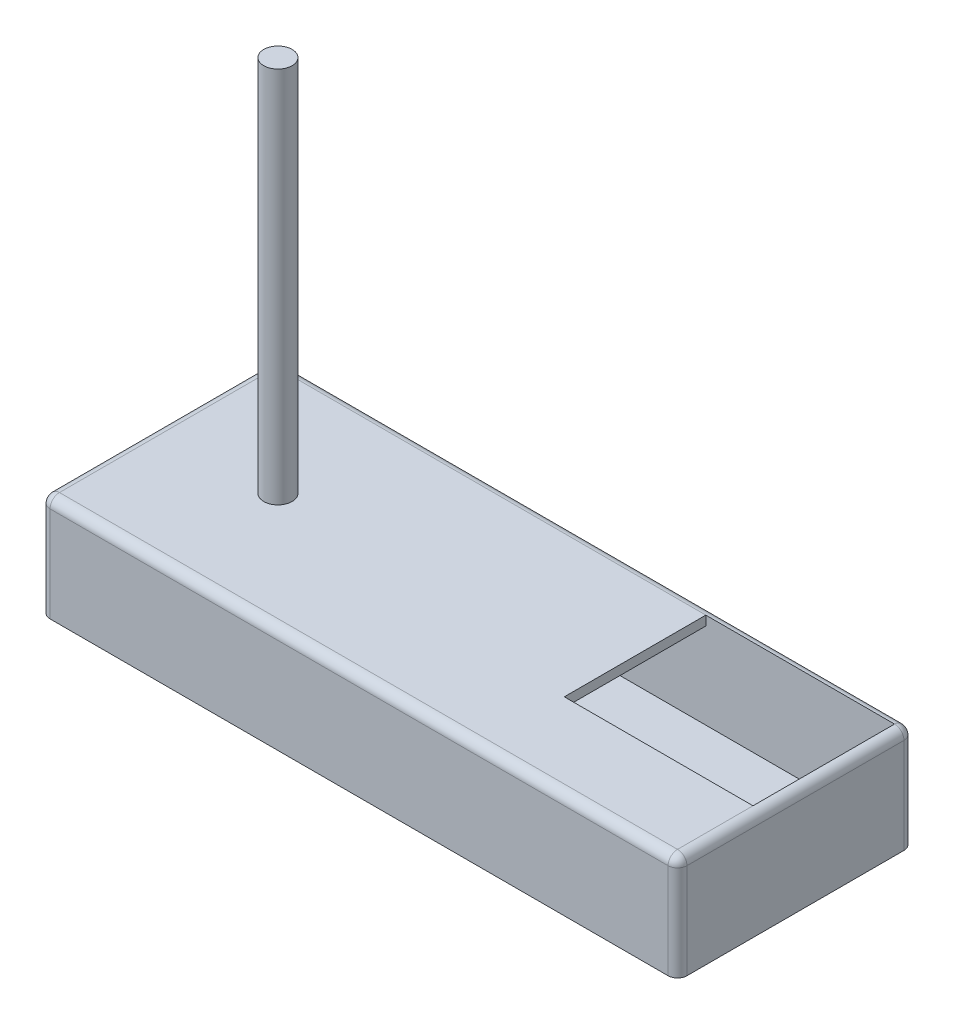
ISO-10303-21;
HEADER;
FILE_DESCRIPTION(('STEP AP214'),'2;1');
FILE_NAME('part.step','',(''),(''),'','','');
FILE_SCHEMA(('AUTOMOTIVE_DESIGN { 1 0 10303 214 1 1 1 1 }'));
ENDSEC;
DATA;
#1=APPLICATION_CONTEXT('core data for automotive mechanical design processes');
#2=APPLICATION_PROTOCOL_DEFINITION('international standard','automotive_design',2000,#1);
#3=PRODUCT_CONTEXT('',#1,'mechanical');
#4=PRODUCT('Part','Part','',(#3));
#5=PRODUCT_RELATED_PRODUCT_CATEGORY('part','',(#4));
#6=PRODUCT_DEFINITION_FORMATION('','',#4);
#7=PRODUCT_DEFINITION_CONTEXT('part definition',#1,'design');
#8=PRODUCT_DEFINITION('design','',#6,#7);
#9=PRODUCT_DEFINITION_SHAPE('','',#8);
#10=(LENGTH_UNIT() NAMED_UNIT(*) SI_UNIT(.MILLI.,.METRE.));
#11=(NAMED_UNIT(*) PLANE_ANGLE_UNIT() SI_UNIT($,.RADIAN.));
#12=(NAMED_UNIT(*) SI_UNIT($,.STERADIAN.) SOLID_ANGLE_UNIT());
#13=UNCERTAINTY_MEASURE_WITH_UNIT(LENGTH_MEASURE(1.E-05),#10,'distance_accuracy_value','');
#14=(GEOMETRIC_REPRESENTATION_CONTEXT(3) GLOBAL_UNCERTAINTY_ASSIGNED_CONTEXT((#13)) GLOBAL_UNIT_ASSIGNED_CONTEXT((#10,
#11,#12)) REPRESENTATION_CONTEXT('',''));
#15=CARTESIAN_POINT('',(0.,0.,0.));
#16=DIRECTION('',(0.,0.,1.));
#17=DIRECTION('',(1.,0.,0.));
#18=AXIS2_PLACEMENT_3D('',#15,#16,#17);
#19=CARTESIAN_POINT('',(-83.185,28.194,-31.75));
#20=DIRECTION('',(1.,0.,0.));
#21=DIRECTION('',(0.,0.,-1.));
#22=AXIS2_PLACEMENT_3D('',#19,#20,#21);
#23=PLANE('',#22);
#24=DIRECTION('',(0.,-1.,0.));
#25=VECTOR('',#24,1.);
#26=CARTESIAN_POINT('',(-83.185,28.194,-29.21));
#27=LINE('',#26,#25);
#28=CARTESIAN_POINT('',(-83.185,2.77966033261084,-29.21));
#29=VERTEX_POINT('',#28);
#30=CARTESIAN_POINT('',(-83.185,2.54,-29.21));
#31=VERTEX_POINT('',#30);
#32=EDGE_CURVE('E334',#29,#31,#27,.T.);
#33=ORIENTED_EDGE('',*,*,#32,.F.);
#34=DIRECTION('',(0.,0.,1.));
#35=VECTOR('',#34,1.);
#36=CARTESIAN_POINT('',(-83.185,2.77966033261084,29.21));
#37=LINE('',#36,#35);
#38=CARTESIAN_POINT('',(-83.185,2.77966033261084,29.21));
#39=VERTEX_POINT('',#38);
#40=EDGE_CURVE('E178',#29,#39,#37,.T.);
#41=ORIENTED_EDGE('',*,*,#40,.T.);
#42=DIRECTION('',(0.,-1.,0.));
#43=VECTOR('',#42,1.);
#44=CARTESIAN_POINT('',(-83.185,28.194,29.21));
#45=LINE('',#44,#43);
#46=CARTESIAN_POINT('',(-83.185,2.54,29.21));
#47=VERTEX_POINT('',#46);
#48=EDGE_CURVE('E175',#39,#47,#45,.T.);
#49=ORIENTED_EDGE('',*,*,#48,.T.);
#50=DIRECTION('',(0.,0.,1.));
#51=VECTOR('',#50,1.);
#52=CARTESIAN_POINT('',(-83.185,2.54,0.));
#53=LINE('',#52,#51);
#54=EDGE_CURVE('E328',#31,#47,#53,.T.);
#55=ORIENTED_EDGE('',*,*,#54,.F.);
#56=EDGE_LOOP('',(#33,#41,#49,#55));
#57=FACE_BOUND('',#56,.T.);
#58=ADVANCED_FACE('F47',(#57),#23,.T.);
#59=CARTESIAN_POINT('',(0.,28.194,0.));
#60=DIRECTION('',(0.,-1.,0.));
#61=DIRECTION('',(0.,0.,-1.));
#62=AXIS2_PLACEMENT_3D('',#59,#60,#61);
#63=PLANE('',#62);
#64=CARTESIAN_POINT('',(-53.5798390640864,28.194,0.));
#65=DIRECTION('',(0.,-1.,0.));
#66=DIRECTION('',(0.,0.,-1.));
#67=AXIS2_PLACEMENT_3D('',#64,#65,#66);
#68=CIRCLE('',#67,3.81);
#69=CARTESIAN_POINT('',(-53.5798390640864,28.194,-3.81));
#70=VERTEX_POINT('',#69);
#71=EDGE_CURVE('E11',#70,#70,#68,.F.);
#72=ORIENTED_EDGE('',*,*,#71,.F.);
#73=EDGE_LOOP('',(#72));
#74=FACE_BOUND('',#73,.T.);
#75=DIRECTION('',(-1.,0.,0.));
#76=VECTOR('',#75,1.);
#77=CARTESIAN_POINT('',(83.185,28.194,8.89));
#78=LINE('',#77,#76);
#79=CARTESIAN_POINT('',(83.185,28.194,8.89));
#80=VERTEX_POINT('',#79);
#81=CARTESIAN_POINT('',(32.385,28.194,8.89));
#82=VERTEX_POINT('',#81);
#83=EDGE_CURVE('E435',#80,#82,#78,.T.);
#84=ORIENTED_EDGE('',*,*,#83,.T.);
#85=DIRECTION('',(0.,0.,1.));
#86=VECTOR('',#85,1.);
#87=CARTESIAN_POINT('',(32.385,28.194,-29.21));
#88=LINE('',#87,#86);
#89=CARTESIAN_POINT('',(32.385,28.194,-29.21));
#90=VERTEX_POINT('',#89);
#91=EDGE_CURVE('E295',#90,#82,#88,.T.);
#92=ORIENTED_EDGE('',*,*,#91,.F.);
#93=DIRECTION('',(-1.,0.,0.));
#94=VECTOR('',#93,1.);
#95=CARTESIAN_POINT('',(0.,28.194,-29.21));
#96=LINE('',#95,#94);
#97=CARTESIAN_POINT('',(-83.185,28.194,-29.21));
#98=VERTEX_POINT('',#97);
#99=EDGE_CURVE('E343',#90,#98,#96,.T.);
#100=ORIENTED_EDGE('',*,*,#99,.T.);
#101=DIRECTION('',(0.,0.,1.));
#102=VECTOR('',#101,1.);
#103=CARTESIAN_POINT('',(-83.185,28.194,0.));
#104=LINE('',#103,#102);
#105=CARTESIAN_POINT('',(-83.185,28.194,29.21));
#106=VERTEX_POINT('',#105);
#107=EDGE_CURVE('E241',#98,#106,#104,.T.);
#108=ORIENTED_EDGE('',*,*,#107,.T.);
#109=DIRECTION('',(1.,0.,0.));
#110=VECTOR('',#109,1.);
#111=CARTESIAN_POINT('',(0.,28.194,29.21));
#112=LINE('',#111,#110);
#113=CARTESIAN_POINT('',(83.185,28.194,29.21));
#114=VERTEX_POINT('',#113);
#115=EDGE_CURVE('E379',#106,#114,#112,.T.);
#116=ORIENTED_EDGE('',*,*,#115,.T.);
#117=DIRECTION('',(0.,0.,-1.));
#118=VECTOR('',#117,1.);
#119=CARTESIAN_POINT('',(83.185,28.194,0.));
#120=LINE('',#119,#118);
#121=EDGE_CURVE('E56',#114,#80,#120,.T.);
#122=ORIENTED_EDGE('',*,*,#121,.T.);
#123=EDGE_LOOP('',(#84,#92,#100,#108,#116,#122));
#124=FACE_BOUND('',#123,.T.);
#125=ADVANCED_FACE('F463',(#74,#124),#63,.F.);
#126=CARTESIAN_POINT('',(-85.725,28.194,-31.75));
#127=DIRECTION('',(1.,0.,0.));
#128=DIRECTION('',(0.,0.,-1.));
#129=AXIS2_PLACEMENT_3D('',#126,#127,#128);
#130=PLANE('',#129);
#131=DIRECTION('',(0.,-1.,0.));
#132=VECTOR('',#131,1.);
#133=CARTESIAN_POINT('',(-85.725,28.194,29.21));
#134=LINE('',#133,#132);
#135=CARTESIAN_POINT('',(-85.725,0.,29.21));
#136=VERTEX_POINT('',#135);
#137=CARTESIAN_POINT('',(-85.725,2.77966033261084,29.21));
#138=VERTEX_POINT('',#137);
#139=EDGE_CURVE('E195',#136,#138,#134,.F.);
#140=ORIENTED_EDGE('',*,*,#139,.T.);
#141=DIRECTION('',(0.,0.,1.));
#142=VECTOR('',#141,1.);
#143=CARTESIAN_POINT('',(-85.725,2.77966033261084,29.21));
#144=LINE('',#143,#142);
#145=CARTESIAN_POINT('',(-85.725,2.77966033261084,-29.21));
#146=VERTEX_POINT('',#145);
#147=EDGE_CURVE('E181',#146,#138,#144,.T.);
#148=ORIENTED_EDGE('',*,*,#147,.F.);
#149=DIRECTION('',(0.,-1.,0.));
#150=VECTOR('',#149,1.);
#151=CARTESIAN_POINT('',(-85.725,28.194,-29.21));
#152=LINE('',#151,#150);
#153=CARTESIAN_POINT('',(-85.725,0.,-29.21));
#154=VERTEX_POINT('',#153);
#155=EDGE_CURVE('E207',#146,#154,#152,.T.);
#156=ORIENTED_EDGE('',*,*,#155,.T.);
#157=DIRECTION('',(0.,0.,1.));
#158=VECTOR('',#157,1.);
#159=CARTESIAN_POINT('',(-85.725,0.,-31.75));
#160=LINE('',#159,#158);
#161=EDGE_CURVE('E205',#154,#136,#160,.T.);
#162=ORIENTED_EDGE('',*,*,#161,.T.);
#163=EDGE_LOOP('',(#140,#148,#156,#162));
#164=FACE_BOUND('',#163,.T.);
#165=ADVANCED_FACE('F203',(#164),#130,.F.);
#166=CARTESIAN_POINT('',(85.725,28.194,31.75));
#167=DIRECTION('',(0.,0.,-1.));
#168=DIRECTION('',(-1.,0.,0.));
#169=AXIS2_PLACEMENT_3D('',#166,#167,#168);
#170=PLANE('',#169);
#171=DIRECTION('',(1.,0.,0.));
#172=VECTOR('',#171,1.);
#173=CARTESIAN_POINT('',(85.725,0.,31.75));
#174=LINE('',#173,#172);
#175=CARTESIAN_POINT('',(-83.185,0.,31.75));
#176=VERTEX_POINT('',#175);
#177=CARTESIAN_POINT('',(83.185,0.,31.75));
#178=VERTEX_POINT('',#177);
#179=EDGE_CURVE('E336',#176,#178,#174,.T.);
#180=ORIENTED_EDGE('',*,*,#179,.T.);
#181=DIRECTION('',(0.,-1.,0.));
#182=VECTOR('',#181,1.);
#183=CARTESIAN_POINT('',(83.185,28.194,31.75));
#184=LINE('',#183,#182);
#185=CARTESIAN_POINT('',(83.185,25.654,31.75));
#186=VERTEX_POINT('',#185);
#187=EDGE_CURVE('E275',#178,#186,#184,.F.);
#188=ORIENTED_EDGE('',*,*,#187,.T.);
#189=DIRECTION('',(1.,0.,0.));
#190=VECTOR('',#189,1.);
#191=CARTESIAN_POINT('',(85.725,25.654,31.75));
#192=LINE('',#191,#190);
#193=CARTESIAN_POINT('',(-83.1849999999999,25.654,31.75));
#194=VERTEX_POINT('',#193);
#195=EDGE_CURVE('E215',#186,#194,#192,.F.);
#196=ORIENTED_EDGE('',*,*,#195,.T.);
#197=DIRECTION('',(0.,-1.,0.));
#198=VECTOR('',#197,1.);
#199=CARTESIAN_POINT('',(-83.185,28.194,31.75));
#200=LINE('',#199,#198);
#201=EDGE_CURVE('E234',#194,#176,#200,.T.);
#202=ORIENTED_EDGE('',*,*,#201,.T.);
#203=EDGE_LOOP('',(#180,#188,#196,#202));
#204=FACE_BOUND('',#203,.T.);
#205=ADVANCED_FACE('F386',(#204),#170,.F.);
#206=CARTESIAN_POINT('',(85.725,28.194,-31.75));
#207=DIRECTION('',(-1.,0.,0.));
#208=DIRECTION('',(0.,0.,1.));
#209=AXIS2_PLACEMENT_3D('',#206,#207,#208);
#210=PLANE('',#209);
#211=DIRECTION('',(0.,0.,-1.));
#212=VECTOR('',#211,1.);
#213=CARTESIAN_POINT('',(85.725,25.654,-31.75));
#214=LINE('',#213,#212);
#215=CARTESIAN_POINT('',(85.725,25.654,-29.21));
#216=VERTEX_POINT('',#215);
#217=CARTESIAN_POINT('',(85.725,25.654,29.21));
#218=VERTEX_POINT('',#217);
#219=EDGE_CURVE('E244',#216,#218,#214,.F.);
#220=ORIENTED_EDGE('',*,*,#219,.T.);
#221=DIRECTION('',(0.,-1.,0.));
#222=VECTOR('',#221,1.);
#223=CARTESIAN_POINT('',(85.725,28.194,29.21));
#224=LINE('',#223,#222);
#225=CARTESIAN_POINT('',(85.725,0.,29.21));
#226=VERTEX_POINT('',#225);
#227=EDGE_CURVE('E265',#218,#226,#224,.T.);
#228=ORIENTED_EDGE('',*,*,#227,.T.);
#229=DIRECTION('',(0.,0.,-1.));
#230=VECTOR('',#229,1.);
#231=CARTESIAN_POINT('',(85.725,0.,-31.75));
#232=LINE('',#231,#230);
#233=CARTESIAN_POINT('',(85.725,0.,-29.21));
#234=VERTEX_POINT('',#233);
#235=EDGE_CURVE('E329',#226,#234,#232,.T.);
#236=ORIENTED_EDGE('',*,*,#235,.T.);
#237=DIRECTION('',(0.,-1.,0.));
#238=VECTOR('',#237,1.);
#239=CARTESIAN_POINT('',(85.725,28.194,-29.21));
#240=LINE('',#239,#238);
#241=EDGE_CURVE('E262',#234,#216,#240,.F.);
#242=ORIENTED_EDGE('',*,*,#241,.T.);
#243=EDGE_LOOP('',(#220,#228,#236,#242));
#244=FACE_BOUND('',#243,.T.);
#245=ADVANCED_FACE('F713',(#244),#210,.F.);
#246=CARTESIAN_POINT('',(85.725,28.194,-31.75));
#247=DIRECTION('',(0.,0.,1.));
#248=DIRECTION('',(1.,0.,0.));
#249=AXIS2_PLACEMENT_3D('',#246,#247,#248);
#250=PLANE('',#249);
#251=DIRECTION('',(-1.,0.,0.));
#252=VECTOR('',#251,1.);
#253=CARTESIAN_POINT('',(85.725,25.654,-31.75));
#254=LINE('',#253,#252);
#255=CARTESIAN_POINT('',(-83.185,25.654,-31.75));
#256=VERTEX_POINT('',#255);
#257=CARTESIAN_POINT('',(83.185,25.654,-31.75));
#258=VERTEX_POINT('',#257);
#259=EDGE_CURVE('E320',#256,#258,#254,.F.);
#260=ORIENTED_EDGE('',*,*,#259,.T.);
#261=DIRECTION('',(0.,-1.,0.));
#262=VECTOR('',#261,1.);
#263=CARTESIAN_POINT('',(83.185,28.194,-31.75));
#264=LINE('',#263,#262);
#265=CARTESIAN_POINT('',(83.185,0.,-31.75));
#266=VERTEX_POINT('',#265);
#267=EDGE_CURVE('E281',#258,#266,#264,.T.);
#268=ORIENTED_EDGE('',*,*,#267,.T.);
#269=DIRECTION('',(-1.,0.,0.));
#270=VECTOR('',#269,1.);
#271=CARTESIAN_POINT('',(85.725,0.,-31.75));
#272=LINE('',#271,#270);
#273=CARTESIAN_POINT('',(-83.185,0.,-31.75));
#274=VERTEX_POINT('',#273);
#275=EDGE_CURVE('E318',#266,#274,#272,.T.);
#276=ORIENTED_EDGE('',*,*,#275,.T.);
#277=DIRECTION('',(0.,-1.,0.));
#278=VECTOR('',#277,1.);
#279=CARTESIAN_POINT('',(-83.185,28.194,-31.75));
#280=LINE('',#279,#278);
#281=EDGE_CURVE('E227',#274,#256,#280,.F.);
#282=ORIENTED_EDGE('',*,*,#281,.T.);
#283=EDGE_LOOP('',(#260,#268,#276,#282));
#284=FACE_BOUND('',#283,.T.);
#285=ADVANCED_FACE('F317',(#284),#250,.F.);
#286=CARTESIAN_POINT('',(0.,0.,0.));
#287=DIRECTION('',(0.,-1.,0.));
#288=DIRECTION('',(0.,0.,-1.));
#289=AXIS2_PLACEMENT_3D('',#286,#287,#288);
#290=PLANE('',#289);
#291=ORIENTED_EDGE('',*,*,#235,.F.);
#292=CARTESIAN_POINT('',(83.185,0.,29.21));
#293=DIRECTION('',(0.,-1.,0.));
#294=DIRECTION('',(0.,0.,-1.));
#295=AXIS2_PLACEMENT_3D('',#292,#293,#294);
#296=CIRCLE('',#295,2.54);
#297=EDGE_CURVE('E272',#226,#178,#296,.T.);
#298=ORIENTED_EDGE('',*,*,#297,.T.);
#299=ORIENTED_EDGE('',*,*,#179,.F.);
#300=CARTESIAN_POINT('',(-83.185,0.,29.21));
#301=DIRECTION('',(0.,-1.,0.));
#302=DIRECTION('',(0.,0.,-1.));
#303=AXIS2_PLACEMENT_3D('',#300,#301,#302);
#304=CIRCLE('',#303,2.54);
#305=EDGE_CURVE('E220',#176,#136,#304,.T.);
#306=ORIENTED_EDGE('',*,*,#305,.T.);
#307=ORIENTED_EDGE('',*,*,#161,.F.);
#308=CARTESIAN_POINT('',(-83.185,0.,-29.21));
#309=DIRECTION('',(0.,-1.,0.));
#310=DIRECTION('',(0.,0.,-1.));
#311=AXIS2_PLACEMENT_3D('',#308,#309,#310);
#312=CIRCLE('',#311,2.54);
#313=EDGE_CURVE('E223',#154,#274,#312,.T.);
#314=ORIENTED_EDGE('',*,*,#313,.T.);
#315=ORIENTED_EDGE('',*,*,#275,.F.);
#316=CARTESIAN_POINT('',(83.185,0.,-29.21));
#317=DIRECTION('',(0.,-1.,0.));
#318=DIRECTION('',(0.,0.,-1.));
#319=AXIS2_PLACEMENT_3D('',#316,#317,#318);
#320=CIRCLE('',#319,2.54);
#321=EDGE_CURVE('E269',#266,#234,#320,.T.);
#322=ORIENTED_EDGE('',*,*,#321,.T.);
#323=EDGE_LOOP('',(#291,#298,#299,#306,#307,#314,#315,#322));
#324=FACE_BOUND('',#323,.T.);
#325=ADVANCED_FACE('F323',(#324),#290,.T.);
#326=CARTESIAN_POINT('',(0.,25.654,-29.21));
#327=DIRECTION('',(-1.,0.,0.));
#328=DIRECTION('',(0.,0.,1.));
#329=AXIS2_PLACEMENT_3D('',#326,#327,#328);
#330=CYLINDRICAL_SURFACE('',#329,2.54);
#331=CARTESIAN_POINT('',(83.185,28.194,-29.21));
#332=VERTEX_POINT('',#331);
#333=EDGE_CURVE('E373',#332,#90,#96,.T.);
#334=ORIENTED_EDGE('',*,*,#333,.F.);
#335=CARTESIAN_POINT('',(83.185,25.654,-29.21));
#336=DIRECTION('',(-1.,0.,0.));
#337=DIRECTION('',(0.,0.,1.));
#338=AXIS2_PLACEMENT_3D('',#335,#336,#337);
#339=CIRCLE('',#338,2.54);
#340=EDGE_CURVE('E284',#332,#258,#339,.T.);
#341=ORIENTED_EDGE('',*,*,#340,.T.);
#342=ORIENTED_EDGE('',*,*,#259,.F.);
#343=CARTESIAN_POINT('',(-83.185,25.654,-29.21));
#344=DIRECTION('',(-1.,0.,0.));
#345=DIRECTION('',(0.,0.,1.));
#346=AXIS2_PLACEMENT_3D('',#343,#344,#345);
#347=CIRCLE('',#346,2.54);
#348=EDGE_CURVE('E230',#256,#98,#347,.F.);
#349=ORIENTED_EDGE('',*,*,#348,.T.);
#350=ORIENTED_EDGE('',*,*,#99,.F.);
#351=EDGE_LOOP('',(#334,#341,#342,#349,#350));
#352=FACE_BOUND('',#351,.T.);
#353=ADVANCED_FACE('F469',(#352),#330,.T.);
#354=CARTESIAN_POINT('',(0.,25.654,29.21));
#355=DIRECTION('',(1.,0.,0.));
#356=DIRECTION('',(0.,0.,-1.));
#357=AXIS2_PLACEMENT_3D('',#354,#355,#356);
#358=CYLINDRICAL_SURFACE('',#357,2.54);
#359=ORIENTED_EDGE('',*,*,#195,.F.);
#360=CARTESIAN_POINT('',(83.185,25.654,29.21));
#361=DIRECTION('',(1.,0.,0.));
#362=DIRECTION('',(0.,0.,-1.));
#363=AXIS2_PLACEMENT_3D('',#360,#361,#362);
#364=CIRCLE('',#363,2.54);
#365=EDGE_CURVE('E278',#186,#114,#364,.F.);
#366=ORIENTED_EDGE('',*,*,#365,.T.);
#367=ORIENTED_EDGE('',*,*,#115,.F.);
#368=CARTESIAN_POINT('',(-83.185,25.654,29.21));
#369=DIRECTION('',(1.,0.,0.));
#370=DIRECTION('',(0.,0.,-1.));
#371=AXIS2_PLACEMENT_3D('',#368,#369,#370);
#372=CIRCLE('',#371,2.54);
#373=EDGE_CURVE('E237',#106,#194,#372,.T.);
#374=ORIENTED_EDGE('',*,*,#373,.T.);
#375=EDGE_LOOP('',(#359,#366,#367,#374));
#376=FACE_BOUND('',#375,.T.);
#377=ADVANCED_FACE('F393',(#376),#358,.T.);
#378=CARTESIAN_POINT('',(-83.185,28.194,29.21));
#379=DIRECTION('',(0.,-1.,0.));
#380=DIRECTION('',(0.,0.,-1.));
#381=AXIS2_PLACEMENT_3D('',#378,#379,#380);
#382=CYLINDRICAL_SURFACE('',#381,2.54);
#383=ORIENTED_EDGE('',*,*,#305,.F.);
#384=ORIENTED_EDGE('',*,*,#201,.F.);
#385=CARTESIAN_POINT('',(-83.185,25.654,29.21));
#386=DIRECTION('',(0.,1.,0.));
#387=DIRECTION('',(0.,0.,1.));
#388=AXIS2_PLACEMENT_3D('',#385,#386,#387);
#389=CIRCLE('',#388,2.54);
#390=CARTESIAN_POINT('',(-85.725,25.654,29.21));
#391=VERTEX_POINT('',#390);
#392=EDGE_CURVE('E198',#391,#194,#389,.T.);
#393=ORIENTED_EDGE('',*,*,#392,.F.);
#394=DIRECTION('',(0.,1.,0.));
#395=VECTOR('',#394,1.);
#396=CARTESIAN_POINT('',(-85.725,25.654,29.21));
#397=LINE('',#396,#395);
#398=EDGE_CURVE('E173',#138,#391,#397,.T.);
#399=ORIENTED_EDGE('',*,*,#398,.F.);
#400=ORIENTED_EDGE('',*,*,#139,.F.);
#401=EDGE_LOOP('',(#383,#384,#393,#399,#400));
#402=FACE_BOUND('',#401,.T.);
#403=ADVANCED_FACE('F194',(#402),#382,.T.);
#404=CARTESIAN_POINT('',(-83.185,25.654,29.21));
#405=DIRECTION('',(1.,0.,0.));
#406=DIRECTION('',(0.,0.,-1.));
#407=AXIS2_PLACEMENT_3D('',#404,#405,#406);
#408=SPHERICAL_SURFACE('',#407,2.54);
#409=ORIENTED_EDGE('',*,*,#392,.T.);
#410=ORIENTED_EDGE('',*,*,#373,.F.);
#411=CARTESIAN_POINT('',(-83.185,25.654,29.21));
#412=DIRECTION('',(0.,0.,-1.));
#413=DIRECTION('',(-1.,0.,0.));
#414=AXIS2_PLACEMENT_3D('',#411,#412,#413);
#415=CIRCLE('',#414,2.54);
#416=EDGE_CURVE('E254',#391,#106,#415,.T.);
#417=ORIENTED_EDGE('',*,*,#416,.F.);
#418=EDGE_LOOP('',(#409,#410,#417));
#419=FACE_BOUND('',#418,.T.);
#420=ADVANCED_FACE('F395',(#419),#408,.T.);
#421=CARTESIAN_POINT('',(-83.185,25.654,0.));
#422=DIRECTION('',(0.,0.,1.));
#423=DIRECTION('',(1.,0.,0.));
#424=AXIS2_PLACEMENT_3D('',#421,#422,#423);
#425=CYLINDRICAL_SURFACE('',#424,2.54);
#426=ORIENTED_EDGE('',*,*,#416,.T.);
#427=ORIENTED_EDGE('',*,*,#107,.F.);
#428=CARTESIAN_POINT('',(-83.185,25.654,-29.21));
#429=DIRECTION('',(0.,0.,-1.));
#430=DIRECTION('',(-1.,0.,0.));
#431=AXIS2_PLACEMENT_3D('',#428,#429,#430);
#432=CIRCLE('',#431,2.54);
#433=CARTESIAN_POINT('',(-85.725,25.654,-29.21));
#434=VERTEX_POINT('',#433);
#435=EDGE_CURVE('E249',#434,#98,#432,.T.);
#436=ORIENTED_EDGE('',*,*,#435,.F.);
#437=DIRECTION('',(0.,0.,1.));
#438=VECTOR('',#437,1.);
#439=CARTESIAN_POINT('',(-85.725,25.654,-31.75));
#440=LINE('',#439,#438);
#441=EDGE_CURVE('E208',#391,#434,#440,.F.);
#442=ORIENTED_EDGE('',*,*,#441,.F.);
#443=EDGE_LOOP('',(#426,#427,#436,#442));
#444=FACE_BOUND('',#443,.T.);
#445=ADVANCED_FACE('F400',(#444),#425,.T.);
#446=CARTESIAN_POINT('',(-83.185,25.654,-29.21));
#447=DIRECTION('',(1.,0.,0.));
#448=DIRECTION('',(0.,0.,-1.));
#449=AXIS2_PLACEMENT_3D('',#446,#447,#448);
#450=SPHERICAL_SURFACE('',#449,2.54);
#451=ORIENTED_EDGE('',*,*,#435,.T.);
#452=ORIENTED_EDGE('',*,*,#348,.F.);
#453=CARTESIAN_POINT('',(-83.185,25.654,-29.21));
#454=DIRECTION('',(0.,-1.,0.));
#455=DIRECTION('',(0.,0.,-1.));
#456=AXIS2_PLACEMENT_3D('',#453,#454,#455);
#457=CIRCLE('',#456,2.54);
#458=EDGE_CURVE('E245',#434,#256,#457,.T.);
#459=ORIENTED_EDGE('',*,*,#458,.F.);
#460=EDGE_LOOP('',(#451,#452,#459));
#461=FACE_BOUND('',#460,.T.);
#462=ADVANCED_FACE('F516',(#461),#450,.T.);
#463=CARTESIAN_POINT('',(-83.185,28.194,-29.21));
#464=DIRECTION('',(0.,-1.,0.));
#465=DIRECTION('',(0.,0.,-1.));
#466=AXIS2_PLACEMENT_3D('',#463,#464,#465);
#467=CYLINDRICAL_SURFACE('',#466,2.54);
#468=ORIENTED_EDGE('',*,*,#458,.T.);
#469=ORIENTED_EDGE('',*,*,#281,.F.);
#470=ORIENTED_EDGE('',*,*,#313,.F.);
#471=ORIENTED_EDGE('',*,*,#155,.F.);
#472=EDGE_CURVE('E212',#434,#146,#152,.T.);
#473=ORIENTED_EDGE('',*,*,#472,.F.);
#474=EDGE_LOOP('',(#468,#469,#470,#471,#473));
#475=FACE_BOUND('',#474,.T.);
#476=ADVANCED_FACE('F513',(#475),#467,.T.);
#477=CARTESIAN_POINT('',(83.185,28.194,-29.21));
#478=DIRECTION('',(0.,-1.,0.));
#479=DIRECTION('',(0.,0.,-1.));
#480=AXIS2_PLACEMENT_3D('',#477,#478,#479);
#481=CYLINDRICAL_SURFACE('',#480,2.54);
#482=ORIENTED_EDGE('',*,*,#321,.F.);
#483=ORIENTED_EDGE('',*,*,#267,.F.);
#484=CARTESIAN_POINT('',(83.185,25.654,-29.21));
#485=DIRECTION('',(0.,1.,0.));
#486=DIRECTION('',(0.,0.,1.));
#487=AXIS2_PLACEMENT_3D('',#484,#485,#486);
#488=CIRCLE('',#487,2.54);
#489=EDGE_CURVE('E250',#216,#258,#488,.T.);
#490=ORIENTED_EDGE('',*,*,#489,.F.);
#491=ORIENTED_EDGE('',*,*,#241,.F.);
#492=EDGE_LOOP('',(#482,#483,#490,#491));
#493=FACE_BOUND('',#492,.T.);
#494=ADVANCED_FACE('F49',(#493),#481,.T.);
#495=CARTESIAN_POINT('',(83.185,25.654,-29.21));
#496=DIRECTION('',(-1.,0.,0.));
#497=DIRECTION('',(0.,0.,1.));
#498=AXIS2_PLACEMENT_3D('',#495,#496,#497);
#499=SPHERICAL_SURFACE('',#498,2.54);
#500=ORIENTED_EDGE('',*,*,#489,.T.);
#501=ORIENTED_EDGE('',*,*,#340,.F.);
#502=CARTESIAN_POINT('',(83.185,25.654,-29.21));
#503=DIRECTION('',(0.,0.,1.));
#504=DIRECTION('',(1.,0.,0.));
#505=AXIS2_PLACEMENT_3D('',#502,#503,#504);
#506=CIRCLE('',#505,2.54);
#507=EDGE_CURVE('E299',#216,#332,#506,.T.);
#508=ORIENTED_EDGE('',*,*,#507,.F.);
#509=EDGE_LOOP('',(#500,#501,#508));
#510=FACE_BOUND('',#509,.T.);
#511=ADVANCED_FACE('F308',(#510),#499,.T.);
#512=CARTESIAN_POINT('',(83.185,25.654,0.));
#513=DIRECTION('',(0.,0.,-1.));
#514=DIRECTION('',(-1.,0.,0.));
#515=AXIS2_PLACEMENT_3D('',#512,#513,#514);
#516=CYLINDRICAL_SURFACE('',#515,2.54);
#517=ORIENTED_EDGE('',*,*,#507,.T.);
#518=DIRECTION('',(0.,0.,1.));
#519=VECTOR('',#518,1.);
#520=CARTESIAN_POINT('',(83.185,28.194,-29.21));
#521=LINE('',#520,#519);
#522=EDGE_CURVE('E427',#332,#80,#521,.T.);
#523=ORIENTED_EDGE('',*,*,#522,.T.);
#524=ORIENTED_EDGE('',*,*,#121,.F.);
#525=CARTESIAN_POINT('',(83.185,25.654,29.21));
#526=DIRECTION('',(0.,0.,1.));
#527=DIRECTION('',(1.,0.,0.));
#528=AXIS2_PLACEMENT_3D('',#525,#526,#527);
#529=CIRCLE('',#528,2.54);
#530=EDGE_CURVE('E294',#218,#114,#529,.T.);
#531=ORIENTED_EDGE('',*,*,#530,.F.);
#532=ORIENTED_EDGE('',*,*,#219,.F.);
#533=EDGE_LOOP('',(#517,#523,#524,#531,#532));
#534=FACE_BOUND('',#533,.T.);
#535=ADVANCED_FACE('F465',(#534),#516,.T.);
#536=CARTESIAN_POINT('',(83.185,25.654,29.21));
#537=DIRECTION('',(-1.,0.,0.));
#538=DIRECTION('',(0.,0.,1.));
#539=AXIS2_PLACEMENT_3D('',#536,#537,#538);
#540=SPHERICAL_SURFACE('',#539,2.54);
#541=ORIENTED_EDGE('',*,*,#530,.T.);
#542=ORIENTED_EDGE('',*,*,#365,.F.);
#543=CARTESIAN_POINT('',(83.185,25.654,29.21));
#544=DIRECTION('',(0.,-1.,0.));
#545=DIRECTION('',(0.,0.,-1.));
#546=AXIS2_PLACEMENT_3D('',#543,#544,#545);
#547=CIRCLE('',#546,2.54);
#548=EDGE_CURVE('E290',#218,#186,#547,.T.);
#549=ORIENTED_EDGE('',*,*,#548,.F.);
#550=EDGE_LOOP('',(#541,#542,#549));
#551=FACE_BOUND('',#550,.T.);
#552=ADVANCED_FACE('F459',(#551),#540,.T.);
#553=CARTESIAN_POINT('',(83.185,28.194,29.21));
#554=DIRECTION('',(0.,-1.,0.));
#555=DIRECTION('',(0.,0.,-1.));
#556=AXIS2_PLACEMENT_3D('',#553,#554,#555);
#557=CYLINDRICAL_SURFACE('',#556,2.54);
#558=ORIENTED_EDGE('',*,*,#548,.T.);
#559=ORIENTED_EDGE('',*,*,#187,.F.);
#560=ORIENTED_EDGE('',*,*,#297,.F.);
#561=ORIENTED_EDGE('',*,*,#227,.F.);
#562=EDGE_LOOP('',(#558,#559,#560,#561));
#563=FACE_BOUND('',#562,.T.);
#564=ADVANCED_FACE('F455',(#563),#557,.T.);
#565=CARTESIAN_POINT('',(83.185,-0.001000000000001,8.89));
#566=DIRECTION('',(0.,0.,-1.));
#567=DIRECTION('',(-1.,0.,0.));
#568=AXIS2_PLACEMENT_3D('',#565,#566,#567);
#569=PLANE('',#568);
#570=DIRECTION('',(-1.,0.,0.));
#571=VECTOR('',#570,1.);
#572=CARTESIAN_POINT('',(83.185,25.654,8.89));
#573=LINE('',#572,#571);
#574=CARTESIAN_POINT('',(83.185,25.654,8.89));
#575=VERTEX_POINT('',#574);
#576=CARTESIAN_POINT('',(32.385,25.654,8.89));
#577=VERTEX_POINT('',#576);
#578=EDGE_CURVE('E71',#575,#577,#573,.T.);
#579=ORIENTED_EDGE('',*,*,#578,.T.);
#580=DIRECTION('',(0.,1.,0.));
#581=VECTOR('',#580,1.);
#582=CARTESIAN_POINT('',(32.385,-0.001000000000001,8.89));
#583=LINE('',#582,#581);
#584=EDGE_CURVE('E445',#577,#82,#583,.T.);
#585=ORIENTED_EDGE('',*,*,#584,.T.);
#586=ORIENTED_EDGE('',*,*,#83,.F.);
#587=DIRECTION('',(0.,1.,0.));
#588=VECTOR('',#587,1.);
#589=CARTESIAN_POINT('',(83.185,-0.001000000000001,8.89));
#590=LINE('',#589,#588);
#591=EDGE_CURVE('E440',#575,#80,#590,.T.);
#592=ORIENTED_EDGE('',*,*,#591,.F.);
#593=EDGE_LOOP('',(#579,#585,#586,#592));
#594=FACE_BOUND('',#593,.T.);
#595=ADVANCED_FACE('F476',(#594),#569,.T.);
#596=CARTESIAN_POINT('',(32.385,-0.001000000000001,-29.21));
#597=DIRECTION('',(-1.,0.,0.));
#598=DIRECTION('',(0.,0.,1.));
#599=AXIS2_PLACEMENT_3D('',#596,#597,#598);
#600=PLANE('',#599);
#601=DIRECTION('',(0.,1.,0.));
#602=VECTOR('',#601,1.);
#603=CARTESIAN_POINT('',(32.385,-0.001000000000001,-29.21));
#604=LINE('',#603,#602);
#605=CARTESIAN_POINT('',(32.385,25.654,-29.21));
#606=VERTEX_POINT('',#605);
#607=EDGE_CURVE('E431',#606,#90,#604,.T.);
#608=ORIENTED_EDGE('',*,*,#607,.T.);
#609=ORIENTED_EDGE('',*,*,#91,.T.);
#610=ORIENTED_EDGE('',*,*,#584,.F.);
#611=DIRECTION('',(0.,0.,1.));
#612=VECTOR('',#611,1.);
#613=CARTESIAN_POINT('',(32.385,25.654,-29.21));
#614=LINE('',#613,#612);
#615=EDGE_CURVE('E439',#606,#577,#614,.T.);
#616=ORIENTED_EDGE('',*,*,#615,.F.);
#617=EDGE_LOOP('',(#608,#609,#610,#616));
#618=FACE_BOUND('',#617,.T.);
#619=ADVANCED_FACE('F475',(#618),#600,.F.);
#620=CARTESIAN_POINT('',(85.725,28.194,29.21));
#621=DIRECTION('',(0.,0.,-1.));
#622=DIRECTION('',(-1.,0.,0.));
#623=AXIS2_PLACEMENT_3D('',#620,#621,#622);
#624=PLANE('',#623);
#625=DIRECTION('',(1.,0.,0.));
#626=VECTOR('',#625,1.);
#627=CARTESIAN_POINT('',(0.,2.54,29.21));
#628=LINE('',#627,#626);
#629=CARTESIAN_POINT('',(83.185,2.54,29.21));
#630=VERTEX_POINT('',#629);
#631=EDGE_CURVE('E368',#47,#630,#628,.T.);
#632=ORIENTED_EDGE('',*,*,#631,.F.);
#633=ORIENTED_EDGE('',*,*,#48,.F.);
#634=DIRECTION('',(-1.,0.,0.));
#635=VECTOR('',#634,1.);
#636=CARTESIAN_POINT('',(85.726,2.77966033261084,29.2099999999999));
#637=LINE('',#636,#635);
#638=EDGE_CURVE('E63',#39,#138,#637,.T.);
#639=ORIENTED_EDGE('',*,*,#638,.T.);
#640=ORIENTED_EDGE('',*,*,#398,.T.);
#641=DIRECTION('',(1.,0.,0.));
#642=VECTOR('',#641,1.);
#643=CARTESIAN_POINT('',(0.,25.654,29.21));
#644=LINE('',#643,#642);
#645=CARTESIAN_POINT('',(83.185,25.654,29.21));
#646=VERTEX_POINT('',#645);
#647=EDGE_CURVE('E348',#391,#646,#644,.T.);
#648=ORIENTED_EDGE('',*,*,#647,.T.);
#649=DIRECTION('',(0.,-1.,0.));
#650=VECTOR('',#649,1.);
#651=CARTESIAN_POINT('',(83.185,28.194,29.21));
#652=LINE('',#651,#650);
#653=EDGE_CURVE('E359',#646,#630,#652,.T.);
#654=ORIENTED_EDGE('',*,*,#653,.T.);
#655=EDGE_LOOP('',(#632,#633,#639,#640,#648,#654));
#656=FACE_BOUND('',#655,.T.);
#657=ADVANCED_FACE('F171',(#656),#624,.T.);
#658=CARTESIAN_POINT('',(83.185,28.194,-31.75));
#659=DIRECTION('',(-1.,0.,0.));
#660=DIRECTION('',(0.,0.,1.));
#661=AXIS2_PLACEMENT_3D('',#658,#659,#660);
#662=PLANE('',#661);
#663=DIRECTION('',(0.,0.,-1.));
#664=VECTOR('',#663,1.);
#665=CARTESIAN_POINT('',(83.185,2.54,0.));
#666=LINE('',#665,#664);
#667=CARTESIAN_POINT('',(83.185,2.54,-29.21));
#668=VERTEX_POINT('',#667);
#669=EDGE_CURVE('E363',#630,#668,#666,.T.);
#670=ORIENTED_EDGE('',*,*,#669,.F.);
#671=ORIENTED_EDGE('',*,*,#653,.F.);
#672=DIRECTION('',(0.,0.,-1.));
#673=VECTOR('',#672,1.);
#674=CARTESIAN_POINT('',(83.185,25.654,0.));
#675=LINE('',#674,#673);
#676=EDGE_CURVE('E344',#646,#575,#675,.T.);
#677=ORIENTED_EDGE('',*,*,#676,.T.);
#678=ORIENTED_EDGE('',*,*,#591,.T.);
#679=ORIENTED_EDGE('',*,*,#522,.F.);
#680=DIRECTION('',(0.,-1.,0.));
#681=VECTOR('',#680,1.);
#682=CARTESIAN_POINT('',(83.185,28.194,-29.21));
#683=LINE('',#682,#681);
#684=EDGE_CURVE('E351',#332,#668,#683,.T.);
#685=ORIENTED_EDGE('',*,*,#684,.T.);
#686=EDGE_LOOP('',(#670,#671,#677,#678,#679,#685));
#687=FACE_BOUND('',#686,.T.);
#688=ADVANCED_FACE('F410',(#687),#662,.T.);
#689=CARTESIAN_POINT('',(85.725,28.194,-29.21));
#690=DIRECTION('',(0.,0.,1.));
#691=DIRECTION('',(1.,0.,0.));
#692=AXIS2_PLACEMENT_3D('',#689,#690,#691);
#693=PLANE('',#692);
#694=DIRECTION('',(-1.,0.,0.));
#695=VECTOR('',#694,1.);
#696=CARTESIAN_POINT('',(0.,2.54,-29.21));
#697=LINE('',#696,#695);
#698=EDGE_CURVE('E355',#668,#31,#697,.T.);
#699=ORIENTED_EDGE('',*,*,#698,.F.);
#700=ORIENTED_EDGE('',*,*,#684,.F.);
#701=ORIENTED_EDGE('',*,*,#333,.T.);
#702=ORIENTED_EDGE('',*,*,#607,.F.);
#703=DIRECTION('',(-1.,0.,0.));
#704=VECTOR('',#703,1.);
#705=CARTESIAN_POINT('',(0.,25.654,-29.21));
#706=LINE('',#705,#704);
#707=EDGE_CURVE('E340',#606,#434,#706,.T.);
#708=ORIENTED_EDGE('',*,*,#707,.T.);
#709=ORIENTED_EDGE('',*,*,#472,.T.);
#710=DIRECTION('',(-1.,0.,0.));
#711=VECTOR('',#710,1.);
#712=CARTESIAN_POINT('',(85.726,2.77966033261084,-29.2100000000001));
#713=LINE('',#712,#711);
#714=EDGE_CURVE('E177',#29,#146,#713,.T.);
#715=ORIENTED_EDGE('',*,*,#714,.F.);
#716=ORIENTED_EDGE('',*,*,#32,.T.);
#717=EDGE_LOOP('',(#699,#700,#701,#702,#708,#709,#715,#716));
#718=FACE_BOUND('',#717,.T.);
#719=ADVANCED_FACE('F472',(#718),#693,.T.);
#720=CARTESIAN_POINT('',(0.,25.654,0.));
#721=DIRECTION('',(0.,-1.,0.));
#722=DIRECTION('',(0.,0.,-1.));
#723=AXIS2_PLACEMENT_3D('',#720,#721,#722);
#724=PLANE('',#723);
#725=ORIENTED_EDGE('',*,*,#578,.F.);
#726=ORIENTED_EDGE('',*,*,#676,.F.);
#727=ORIENTED_EDGE('',*,*,#647,.F.);
#728=ORIENTED_EDGE('',*,*,#441,.T.);
#729=ORIENTED_EDGE('',*,*,#707,.F.);
#730=ORIENTED_EDGE('',*,*,#615,.T.);
#731=EDGE_LOOP('',(#725,#726,#727,#728,#729,#730));
#732=FACE_BOUND('',#731,.T.);
#733=ADVANCED_FACE('F404',(#732),#724,.T.);
#734=CARTESIAN_POINT('',(0.,2.54,0.));
#735=DIRECTION('',(0.,-1.,0.));
#736=DIRECTION('',(0.,0.,-1.));
#737=AXIS2_PLACEMENT_3D('',#734,#735,#736);
#738=PLANE('',#737);
#739=ORIENTED_EDGE('',*,*,#54,.T.);
#740=ORIENTED_EDGE('',*,*,#631,.T.);
#741=ORIENTED_EDGE('',*,*,#669,.T.);
#742=ORIENTED_EDGE('',*,*,#698,.T.);
#743=EDGE_LOOP('',(#739,#740,#741,#742));
#744=FACE_BOUND('',#743,.T.);
#745=ADVANCED_FACE('F415',(#744),#738,.F.);
#746=CARTESIAN_POINT('',(-53.5798390640864,129.794,0.));
#747=DIRECTION('',(0.,-1.,0.));
#748=DIRECTION('',(0.,0.,-1.));
#749=AXIS2_PLACEMENT_3D('',#746,#747,#748);
#750=CYLINDRICAL_SURFACE('',#749,3.81);
#751=CARTESIAN_POINT('',(-53.5798390640864,129.794,0.));
#752=DIRECTION('',(0.,1.,0.));
#753=DIRECTION('',(0.,0.,1.));
#754=AXIS2_PLACEMENT_3D('',#751,#752,#753);
#755=CIRCLE('',#754,3.81);
#756=CARTESIAN_POINT('',(-53.5798390640864,129.794,3.81));
#757=VERTEX_POINT('',#756);
#758=EDGE_CURVE('E189',#757,#757,#755,.T.);
#759=ORIENTED_EDGE('',*,*,#758,.F.);
#760=EDGE_LOOP('',(#759));
#761=FACE_BOUND('',#760,.T.);
#762=ORIENTED_EDGE('',*,*,#71,.T.);
#763=EDGE_LOOP('',(#762));
#764=FACE_BOUND('',#763,.T.);
#765=ADVANCED_FACE('F508',(#761,#764),#750,.T.);
#766=CARTESIAN_POINT('',(-53.5798390640864,129.794,0.));
#767=DIRECTION('',(0.,1.,0.));
#768=DIRECTION('',(0.,0.,1.));
#769=AXIS2_PLACEMENT_3D('',#766,#767,#768);
#770=PLANE('',#769);
#771=ORIENTED_EDGE('',*,*,#758,.T.);
#772=EDGE_LOOP('',(#771));
#773=FACE_BOUND('',#772,.T.);
#774=ADVANCED_FACE('F618',(#773),#770,.T.);
#775=CARTESIAN_POINT('',(85.726,2.77966033261084,29.2099999999999));
#776=DIRECTION('',(0.,-1.,0.));
#777=DIRECTION('',(0.,0.,-1.));
#778=AXIS2_PLACEMENT_3D('',#775,#776,#777);
#779=PLANE('',#778);
#780=ORIENTED_EDGE('',*,*,#714,.T.);
#781=ORIENTED_EDGE('',*,*,#147,.T.);
#782=ORIENTED_EDGE('',*,*,#638,.F.);
#783=ORIENTED_EDGE('',*,*,#40,.F.);
#784=EDGE_LOOP('',(#780,#781,#782,#783));
#785=FACE_BOUND('',#784,.T.);
#786=ADVANCED_FACE('F182',(#785),#779,.F.);
#787=CLOSED_SHELL('',(#58,#125,#165,#205,#245,#285,#325,#353,#377,#403,#420,#445,#462,#476,#494,
#511,#535,#552,#564,#595,#619,#657,#688,#719,#733,#745,#765,#774,#786));
#788=MANIFOLD_SOLID_BREP('B2',#787);
#789=ADVANCED_BREP_SHAPE_REPRESENTATION('',(#18,#788),#14);
#790=SHAPE_DEFINITION_REPRESENTATION(#9,#789);
ENDSEC;
END-ISO-10303-21;
